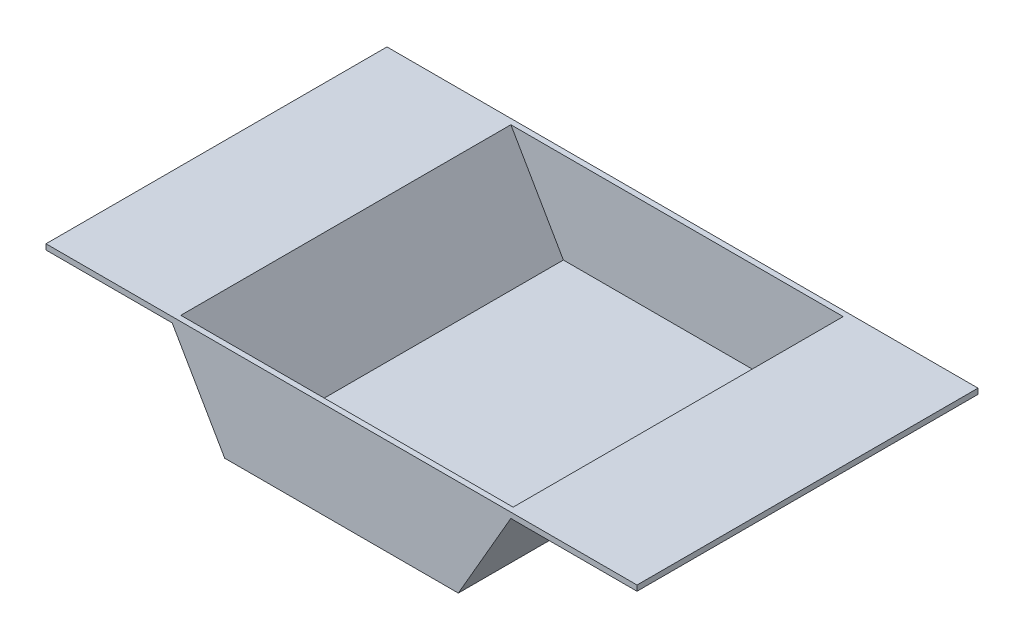
ISO-10303-21;
HEADER;
FILE_DESCRIPTION(('STEP AP214'),'2;1');
FILE_NAME('part.step','',(''),(''),'','','');
FILE_SCHEMA(('AUTOMOTIVE_DESIGN { 1 0 10303 214 1 1 1 1 }'));
ENDSEC;
DATA;
#1=APPLICATION_CONTEXT('core data for automotive mechanical design processes');
#2=APPLICATION_PROTOCOL_DEFINITION('international standard','automotive_design',2000,#1);
#3=PRODUCT_CONTEXT('',#1,'mechanical');
#4=PRODUCT('Part','Part','',(#3));
#5=PRODUCT_RELATED_PRODUCT_CATEGORY('part','',(#4));
#6=PRODUCT_DEFINITION_FORMATION('','',#4);
#7=PRODUCT_DEFINITION_CONTEXT('part definition',#1,'design');
#8=PRODUCT_DEFINITION('design','',#6,#7);
#9=PRODUCT_DEFINITION_SHAPE('','',#8);
#10=(LENGTH_UNIT() NAMED_UNIT(*) SI_UNIT(.MILLI.,.METRE.));
#11=(NAMED_UNIT(*) PLANE_ANGLE_UNIT() SI_UNIT($,.RADIAN.));
#12=(NAMED_UNIT(*) SI_UNIT($,.STERADIAN.) SOLID_ANGLE_UNIT());
#13=UNCERTAINTY_MEASURE_WITH_UNIT(LENGTH_MEASURE(1.E-05),#10,'distance_accuracy_value','');
#14=(GEOMETRIC_REPRESENTATION_CONTEXT(3) GLOBAL_UNCERTAINTY_ASSIGNED_CONTEXT((#13)) GLOBAL_UNIT_ASSIGNED_CONTEXT((#10,
#11,#12)) REPRESENTATION_CONTEXT('',''));
#15=CARTESIAN_POINT('',(0.,0.,0.));
#16=DIRECTION('',(0.,0.,1.));
#17=DIRECTION('',(1.,0.,0.));
#18=AXIS2_PLACEMENT_3D('',#15,#16,#17);
#19=CARTESIAN_POINT('',(-330.2,101.6,381.));
#20=DIRECTION('',(0.,-1.,0.));
#21=DIRECTION('',(0.,0.,-1.));
#22=AXIS2_PLACEMENT_3D('',#19,#20,#21);
#23=PLANE('',#22);
#24=DIRECTION('',(-1.,0.,0.));
#25=VECTOR('',#24,1.);
#26=CARTESIAN_POINT('',(-330.2,101.6,0.));
#27=LINE('',#26,#25);
#28=CARTESIAN_POINT('',(330.2,101.6,0.));
#29=VERTEX_POINT('',#28);
#30=CARTESIAN_POINT('',(-330.2,101.6,0.));
#31=VERTEX_POINT('',#30);
#32=EDGE_CURVE('E102',#29,#31,#27,.T.);
#33=ORIENTED_EDGE('',*,*,#32,.T.);
#34=DIRECTION('',(0.,0.,-1.));
#35=VECTOR('',#34,1.);
#36=CARTESIAN_POINT('',(-330.2,101.6,381.));
#37=LINE('',#36,#35);
#38=CARTESIAN_POINT('',(-330.2,101.6,381.));
#39=VERTEX_POINT('',#38);
#40=EDGE_CURVE('E154',#39,#31,#37,.T.);
#41=ORIENTED_EDGE('',*,*,#40,.F.);
#42=DIRECTION('',(-1.,0.,0.));
#43=VECTOR('',#42,1.);
#44=CARTESIAN_POINT('',(185.658787349666,101.6,381.));
#45=LINE('',#44,#43);
#46=CARTESIAN_POINT('',(330.2,101.6,381.));
#47=VERTEX_POINT('',#46);
#48=EDGE_CURVE('E70',#47,#39,#45,.T.);
#49=ORIENTED_EDGE('',*,*,#48,.F.);
#50=DIRECTION('',(0.,0.,-1.));
#51=VECTOR('',#50,1.);
#52=CARTESIAN_POINT('',(330.2,101.6,381.));
#53=LINE('',#52,#51);
#54=EDGE_CURVE('E148',#47,#29,#53,.T.);
#55=ORIENTED_EDGE('',*,*,#54,.T.);
#56=EDGE_LOOP('',(#33,#41,#49,#55));
#57=FACE_BOUND('',#56,.T.);
#58=DIRECTION('',(0.,0.,-1.));
#59=VECTOR('',#58,1.);
#60=CARTESIAN_POINT('',(185.658787349666,101.6,381.));
#61=LINE('',#60,#59);
#62=CARTESIAN_POINT('',(185.658787349666,101.6,374.904));
#63=VERTEX_POINT('',#62);
#64=CARTESIAN_POINT('',(185.658787349666,101.6,6.096));
#65=VERTEX_POINT('',#64);
#66=EDGE_CURVE('E235',#63,#65,#61,.T.);
#67=ORIENTED_EDGE('',*,*,#66,.F.);
#68=DIRECTION('',(-1.,0.,0.));
#69=VECTOR('',#68,1.);
#70=CARTESIAN_POINT('',(-330.2,101.6,374.904));
#71=LINE('',#70,#69);
#72=CARTESIAN_POINT('',(-185.658787349666,101.6,374.904));
#73=VERTEX_POINT('',#72);
#74=EDGE_CURVE('E231',#63,#73,#71,.T.);
#75=ORIENTED_EDGE('',*,*,#74,.T.);
#76=DIRECTION('',(0.,0.,-1.));
#77=VECTOR('',#76,1.);
#78=CARTESIAN_POINT('',(-185.658787349666,101.6,381.));
#79=LINE('',#78,#77);
#80=CARTESIAN_POINT('',(-185.658787349666,101.6,6.096));
#81=VERTEX_POINT('',#80);
#82=EDGE_CURVE('E163',#73,#81,#79,.T.);
#83=ORIENTED_EDGE('',*,*,#82,.T.);
#84=DIRECTION('',(-1.,0.,0.));
#85=VECTOR('',#84,1.);
#86=CARTESIAN_POINT('',(-330.2,101.6,6.09599999999999));
#87=LINE('',#86,#85);
#88=EDGE_CURVE('E226',#65,#81,#87,.T.);
#89=ORIENTED_EDGE('',*,*,#88,.F.);
#90=EDGE_LOOP('',(#67,#75,#83,#89));
#91=FACE_BOUND('',#90,.T.);
#92=ADVANCED_FACE('F45',(#57,#91),#23,.F.);
#93=CARTESIAN_POINT('',(-330.2,101.6,381.));
#94=DIRECTION('',(1.,0.,0.));
#95=DIRECTION('',(0.,0.,-1.));
#96=AXIS2_PLACEMENT_3D('',#93,#94,#95);
#97=PLANE('',#96);
#98=DIRECTION('',(0.,-1.,0.));
#99=VECTOR('',#98,1.);
#100=CARTESIAN_POINT('',(-330.2,101.6,0.));
#101=LINE('',#100,#99);
#102=CARTESIAN_POINT('',(-330.2,95.504,0.));
#103=VERTEX_POINT('',#102);
#104=EDGE_CURVE('E158',#31,#103,#101,.T.);
#105=ORIENTED_EDGE('',*,*,#104,.T.);
#106=DIRECTION('',(0.,0.,-1.));
#107=VECTOR('',#106,1.);
#108=CARTESIAN_POINT('',(-330.2,95.504,381.));
#109=LINE('',#108,#107);
#110=CARTESIAN_POINT('',(-330.2,95.504,381.));
#111=VERTEX_POINT('',#110);
#112=EDGE_CURVE('E11',#111,#103,#109,.T.);
#113=ORIENTED_EDGE('',*,*,#112,.F.);
#114=DIRECTION('',(0.,-1.,0.));
#115=VECTOR('',#114,1.);
#116=CARTESIAN_POINT('',(-330.2,101.6,381.));
#117=LINE('',#116,#115);
#118=EDGE_CURVE('E182',#39,#111,#117,.T.);
#119=ORIENTED_EDGE('',*,*,#118,.F.);
#120=ORIENTED_EDGE('',*,*,#40,.T.);
#121=EDGE_LOOP('',(#105,#113,#119,#120));
#122=FACE_BOUND('',#121,.T.);
#123=ADVANCED_FACE('F47',(#122),#97,.F.);
#124=CARTESIAN_POINT('',(-330.2,95.504,381.));
#125=DIRECTION('',(0.,1.,0.));
#126=DIRECTION('',(0.,0.,1.));
#127=AXIS2_PLACEMENT_3D('',#124,#125,#126);
#128=PLANE('',#127);
#129=DIRECTION('',(1.,0.,0.));
#130=VECTOR('',#129,1.);
#131=CARTESIAN_POINT('',(-330.2,95.504,0.));
#132=LINE('',#131,#130);
#133=CARTESIAN_POINT('',(-189.178314590646,95.504,0.));
#134=VERTEX_POINT('',#133);
#135=EDGE_CURVE('E162',#103,#134,#132,.T.);
#136=ORIENTED_EDGE('',*,*,#135,.T.);
#137=DIRECTION('',(0.,0.,-1.));
#138=VECTOR('',#137,1.);
#139=CARTESIAN_POINT('',(-189.178314590646,95.504,381.));
#140=LINE('',#139,#138);
#141=CARTESIAN_POINT('',(-189.178314590646,95.504,381.));
#142=VERTEX_POINT('',#141);
#143=EDGE_CURVE('E54',#142,#134,#140,.T.);
#144=ORIENTED_EDGE('',*,*,#143,.F.);
#145=DIRECTION('',(1.,0.,0.));
#146=VECTOR('',#145,1.);
#147=CARTESIAN_POINT('',(-330.2,95.504,381.));
#148=LINE('',#147,#146);
#149=EDGE_CURVE('E110',#111,#142,#148,.T.);
#150=ORIENTED_EDGE('',*,*,#149,.F.);
#151=ORIENTED_EDGE('',*,*,#112,.T.);
#152=EDGE_LOOP('',(#136,#144,#150,#151));
#153=FACE_BOUND('',#152,.T.);
#154=ADVANCED_FACE('F313',(#153),#128,.F.);
#155=CARTESIAN_POINT('',(-130.51952724098,-6.096,381.));
#156=DIRECTION('',(0.866025403784439,0.5,0.));
#157=DIRECTION('',(-0.5,0.866025403784439,0.));
#158=AXIS2_PLACEMENT_3D('',#155,#156,#157);
#159=PLANE('',#158);
#160=DIRECTION('',(0.5,-0.866025403784439,0.));
#161=VECTOR('',#160,1.);
#162=CARTESIAN_POINT('',(-130.51952724098,-6.096,0.));
#163=LINE('',#162,#161);
#164=CARTESIAN_POINT('',(-130.51952724098,-6.096,0.));
#165=VERTEX_POINT('',#164);
#166=EDGE_CURVE('E166',#134,#165,#163,.T.);
#167=ORIENTED_EDGE('',*,*,#166,.T.);
#168=DIRECTION('',(0.,0.,-1.));
#169=VECTOR('',#168,1.);
#170=CARTESIAN_POINT('',(-130.51952724098,-6.096,381.));
#171=LINE('',#170,#169);
#172=CARTESIAN_POINT('',(-130.51952724098,-6.096,381.));
#173=VERTEX_POINT('',#172);
#174=EDGE_CURVE('E193',#173,#165,#171,.T.);
#175=ORIENTED_EDGE('',*,*,#174,.F.);
#176=DIRECTION('',(0.5,-0.866025403784439,0.));
#177=VECTOR('',#176,1.);
#178=CARTESIAN_POINT('',(-130.51952724098,-6.096,381.));
#179=LINE('',#178,#177);
#180=EDGE_CURVE('E203',#142,#173,#179,.T.);
#181=ORIENTED_EDGE('',*,*,#180,.F.);
#182=ORIENTED_EDGE('',*,*,#143,.T.);
#183=EDGE_LOOP('',(#167,#175,#181,#182));
#184=FACE_BOUND('',#183,.T.);
#185=ADVANCED_FACE('F201',(#184),#159,.F.);
#186=CARTESIAN_POINT('',(-130.51952724098,-6.096,381.));
#187=DIRECTION('',(0.,1.,0.));
#188=DIRECTION('',(0.,0.,1.));
#189=AXIS2_PLACEMENT_3D('',#186,#187,#188);
#190=PLANE('',#189);
#191=DIRECTION('',(1.,0.,0.));
#192=VECTOR('',#191,1.);
#193=CARTESIAN_POINT('',(-130.51952724098,-6.096,0.));
#194=LINE('',#193,#192);
#195=CARTESIAN_POINT('',(130.51952724098,-6.096,0.));
#196=VERTEX_POINT('',#195);
#197=EDGE_CURVE('E169',#165,#196,#194,.T.);
#198=ORIENTED_EDGE('',*,*,#197,.T.);
#199=DIRECTION('',(0.,0.,-1.));
#200=VECTOR('',#199,1.);
#201=CARTESIAN_POINT('',(130.51952724098,-6.096,381.));
#202=LINE('',#201,#200);
#203=CARTESIAN_POINT('',(130.51952724098,-6.096,381.));
#204=VERTEX_POINT('',#203);
#205=EDGE_CURVE('E189',#204,#196,#202,.T.);
#206=ORIENTED_EDGE('',*,*,#205,.F.);
#207=DIRECTION('',(1.,0.,0.));
#208=VECTOR('',#207,1.);
#209=CARTESIAN_POINT('',(-130.51952724098,-6.096,381.));
#210=LINE('',#209,#208);
#211=EDGE_CURVE('E216',#173,#204,#210,.T.);
#212=ORIENTED_EDGE('',*,*,#211,.F.);
#213=ORIENTED_EDGE('',*,*,#174,.T.);
#214=EDGE_LOOP('',(#198,#206,#212,#213));
#215=FACE_BOUND('',#214,.T.);
#216=ADVANCED_FACE('F211',(#215),#190,.F.);
#217=CARTESIAN_POINT('',(130.51952724098,-6.096,381.));
#218=DIRECTION('',(-0.866025403784439,0.5,0.));
#219=DIRECTION('',(-0.5,-0.866025403784439,0.));
#220=AXIS2_PLACEMENT_3D('',#217,#218,#219);
#221=PLANE('',#220);
#222=DIRECTION('',(0.5,0.866025403784439,0.));
#223=VECTOR('',#222,1.);
#224=CARTESIAN_POINT('',(130.51952724098,-6.096,0.));
#225=LINE('',#224,#223);
#226=CARTESIAN_POINT('',(189.178314590646,95.504,0.));
#227=VERTEX_POINT('',#226);
#228=EDGE_CURVE('E172',#196,#227,#225,.T.);
#229=ORIENTED_EDGE('',*,*,#228,.T.);
#230=DIRECTION('',(0.,0.,-1.));
#231=VECTOR('',#230,1.);
#232=CARTESIAN_POINT('',(189.178314590646,95.504,381.));
#233=LINE('',#232,#231);
#234=CARTESIAN_POINT('',(189.178314590646,95.504,381.));
#235=VERTEX_POINT('',#234);
#236=EDGE_CURVE('E147',#235,#227,#233,.T.);
#237=ORIENTED_EDGE('',*,*,#236,.F.);
#238=DIRECTION('',(0.5,0.866025403784439,0.));
#239=VECTOR('',#238,1.);
#240=CARTESIAN_POINT('',(130.51952724098,-6.096,381.));
#241=LINE('',#240,#239);
#242=EDGE_CURVE('E132',#204,#235,#241,.T.);
#243=ORIENTED_EDGE('',*,*,#242,.F.);
#244=ORIENTED_EDGE('',*,*,#205,.T.);
#245=EDGE_LOOP('',(#229,#237,#243,#244));
#246=FACE_BOUND('',#245,.T.);
#247=ADVANCED_FACE('F214',(#246),#221,.F.);
#248=CARTESIAN_POINT('',(189.178314590646,95.504,381.));
#249=DIRECTION('',(0.,1.,0.));
#250=DIRECTION('',(0.,0.,1.));
#251=AXIS2_PLACEMENT_3D('',#248,#249,#250);
#252=PLANE('',#251);
#253=DIRECTION('',(1.,0.,0.));
#254=VECTOR('',#253,1.);
#255=CARTESIAN_POINT('',(189.178314590646,95.504,0.));
#256=LINE('',#255,#254);
#257=CARTESIAN_POINT('',(330.2,95.504,0.));
#258=VERTEX_POINT('',#257);
#259=EDGE_CURVE('E142',#227,#258,#256,.T.);
#260=ORIENTED_EDGE('',*,*,#259,.T.);
#261=DIRECTION('',(0.,0.,-1.));
#262=VECTOR('',#261,1.);
#263=CARTESIAN_POINT('',(330.2,95.504,381.));
#264=LINE('',#263,#262);
#265=CARTESIAN_POINT('',(330.2,95.504,381.));
#266=VERTEX_POINT('',#265);
#267=EDGE_CURVE('E139',#266,#258,#264,.T.);
#268=ORIENTED_EDGE('',*,*,#267,.F.);
#269=DIRECTION('',(1.,0.,0.));
#270=VECTOR('',#269,1.);
#271=CARTESIAN_POINT('',(189.178314590646,95.504,381.));
#272=LINE('',#271,#270);
#273=EDGE_CURVE('E125',#235,#266,#272,.T.);
#274=ORIENTED_EDGE('',*,*,#273,.F.);
#275=ORIENTED_EDGE('',*,*,#236,.T.);
#276=EDGE_LOOP('',(#260,#268,#274,#275));
#277=FACE_BOUND('',#276,.T.);
#278=ADVANCED_FACE('F140',(#277),#252,.F.);
#279=CARTESIAN_POINT('',(330.2,101.6,381.));
#280=DIRECTION('',(-1.,0.,0.));
#281=DIRECTION('',(0.,0.,1.));
#282=AXIS2_PLACEMENT_3D('',#279,#280,#281);
#283=PLANE('',#282);
#284=DIRECTION('',(0.,1.,0.));
#285=VECTOR('',#284,1.);
#286=CARTESIAN_POINT('',(330.2,101.6,0.));
#287=LINE('',#286,#285);
#288=EDGE_CURVE('E177',#258,#29,#287,.T.);
#289=ORIENTED_EDGE('',*,*,#288,.T.);
#290=ORIENTED_EDGE('',*,*,#54,.F.);
#291=DIRECTION('',(0.,1.,0.));
#292=VECTOR('',#291,1.);
#293=CARTESIAN_POINT('',(330.2,101.6,381.));
#294=LINE('',#293,#292);
#295=EDGE_CURVE('E129',#266,#47,#294,.T.);
#296=ORIENTED_EDGE('',*,*,#295,.F.);
#297=ORIENTED_EDGE('',*,*,#267,.T.);
#298=EDGE_LOOP('',(#289,#290,#296,#297));
#299=FACE_BOUND('',#298,.T.);
#300=ADVANCED_FACE('F150',(#299),#283,.F.);
#301=CARTESIAN_POINT('',(0.,0.,381.));
#302=DIRECTION('',(0.,0.,1.));
#303=DIRECTION('',(1.,0.,0.));
#304=AXIS2_PLACEMENT_3D('',#301,#302,#303);
#305=PLANE('',#304);
#306=ORIENTED_EDGE('',*,*,#118,.T.);
#307=ORIENTED_EDGE('',*,*,#149,.T.);
#308=ORIENTED_EDGE('',*,*,#180,.T.);
#309=ORIENTED_EDGE('',*,*,#211,.T.);
#310=ORIENTED_EDGE('',*,*,#242,.T.);
#311=ORIENTED_EDGE('',*,*,#273,.T.);
#312=ORIENTED_EDGE('',*,*,#295,.T.);
#313=ORIENTED_EDGE('',*,*,#48,.T.);
#314=EDGE_LOOP('',(#306,#307,#308,#309,#310,#311,#312,#313));
#315=FACE_BOUND('',#314,.T.);
#316=ADVANCED_FACE('F127',(#315),#305,.T.);
#317=CARTESIAN_POINT('',(0.,0.,0.));
#318=DIRECTION('',(0.,0.,1.));
#319=DIRECTION('',(1.,0.,0.));
#320=AXIS2_PLACEMENT_3D('',#317,#318,#319);
#321=PLANE('',#320);
#322=ORIENTED_EDGE('',*,*,#104,.F.);
#323=ORIENTED_EDGE('',*,*,#32,.F.);
#324=ORIENTED_EDGE('',*,*,#288,.F.);
#325=ORIENTED_EDGE('',*,*,#259,.F.);
#326=ORIENTED_EDGE('',*,*,#228,.F.);
#327=ORIENTED_EDGE('',*,*,#197,.F.);
#328=ORIENTED_EDGE('',*,*,#166,.F.);
#329=ORIENTED_EDGE('',*,*,#135,.F.);
#330=EDGE_LOOP('',(#322,#323,#324,#325,#326,#327,#328,#329));
#331=FACE_BOUND('',#330,.T.);
#332=ADVANCED_FACE('F207',(#331),#321,.F.);
#333=CARTESIAN_POINT('',(-125.24023637951,-3.048,381.));
#334=DIRECTION('',(0.866025403784439,0.5,0.));
#335=DIRECTION('',(-0.5,0.866025403784439,0.));
#336=AXIS2_PLACEMENT_3D('',#333,#334,#335);
#337=PLANE('',#336);
#338=DIRECTION('',(0.5,-0.866025403784439,0.));
#339=VECTOR('',#338,1.);
#340=CARTESIAN_POINT('',(-125.24023637951,-3.048,6.09599999999999));
#341=LINE('',#340,#339);
#342=CARTESIAN_POINT('',(-127.,0.,6.096));
#343=VERTEX_POINT('',#342);
#344=EDGE_CURVE('E259',#81,#343,#341,.T.);
#345=ORIENTED_EDGE('',*,*,#344,.F.);
#346=ORIENTED_EDGE('',*,*,#82,.F.);
#347=DIRECTION('',(0.5,-0.866025403784439,0.));
#348=VECTOR('',#347,1.);
#349=CARTESIAN_POINT('',(-125.24023637951,-3.048,374.904));
#350=LINE('',#349,#348);
#351=CARTESIAN_POINT('',(-127.,0.,374.904));
#352=VERTEX_POINT('',#351);
#353=EDGE_CURVE('E61',#73,#352,#350,.T.);
#354=ORIENTED_EDGE('',*,*,#353,.T.);
#355=DIRECTION('',(0.,0.,-1.));
#356=VECTOR('',#355,1.);
#357=CARTESIAN_POINT('',(-127.,0.,381.));
#358=LINE('',#357,#356);
#359=EDGE_CURVE('E255',#352,#343,#358,.T.);
#360=ORIENTED_EDGE('',*,*,#359,.T.);
#361=EDGE_LOOP('',(#345,#346,#354,#360));
#362=FACE_BOUND('',#361,.T.);
#363=ADVANCED_FACE('F278',(#362),#337,.T.);
#364=CARTESIAN_POINT('',(-130.51952724098,0.,381.));
#365=DIRECTION('',(0.,1.,0.));
#366=DIRECTION('',(0.,0.,1.));
#367=AXIS2_PLACEMENT_3D('',#364,#365,#366);
#368=PLANE('',#367);
#369=DIRECTION('',(1.,0.,0.));
#370=VECTOR('',#369,1.);
#371=CARTESIAN_POINT('',(-130.51952724098,0.,6.09599999999999));
#372=LINE('',#371,#370);
#373=CARTESIAN_POINT('',(127.,0.,6.096));
#374=VERTEX_POINT('',#373);
#375=EDGE_CURVE('E248',#343,#374,#372,.T.);
#376=ORIENTED_EDGE('',*,*,#375,.F.);
#377=ORIENTED_EDGE('',*,*,#359,.F.);
#378=DIRECTION('',(1.,0.,0.));
#379=VECTOR('',#378,1.);
#380=CARTESIAN_POINT('',(-130.51952724098,0.,374.904));
#381=LINE('',#380,#379);
#382=CARTESIAN_POINT('',(127.,0.,374.904));
#383=VERTEX_POINT('',#382);
#384=EDGE_CURVE('E240',#352,#383,#381,.T.);
#385=ORIENTED_EDGE('',*,*,#384,.T.);
#386=DIRECTION('',(0.,0.,-1.));
#387=VECTOR('',#386,1.);
#388=CARTESIAN_POINT('',(127.,0.,381.));
#389=LINE('',#388,#387);
#390=EDGE_CURVE('E244',#383,#374,#389,.T.);
#391=ORIENTED_EDGE('',*,*,#390,.T.);
#392=EDGE_LOOP('',(#376,#377,#385,#391));
#393=FACE_BOUND('',#392,.T.);
#394=ADVANCED_FACE('F298',(#393),#368,.T.);
#395=CARTESIAN_POINT('',(125.24023637951,-3.048,381.));
#396=DIRECTION('',(-0.866025403784439,0.5,0.));
#397=DIRECTION('',(-0.5,-0.866025403784439,0.));
#398=AXIS2_PLACEMENT_3D('',#395,#396,#397);
#399=PLANE('',#398);
#400=DIRECTION('',(0.5,0.866025403784439,0.));
#401=VECTOR('',#400,1.);
#402=CARTESIAN_POINT('',(125.24023637951,-3.048,6.09599999999999));
#403=LINE('',#402,#401);
#404=EDGE_CURVE('E230',#374,#65,#403,.T.);
#405=ORIENTED_EDGE('',*,*,#404,.F.);
#406=ORIENTED_EDGE('',*,*,#390,.F.);
#407=DIRECTION('',(0.5,0.866025403784439,0.));
#408=VECTOR('',#407,1.);
#409=CARTESIAN_POINT('',(125.24023637951,-3.048,374.904));
#410=LINE('',#409,#408);
#411=EDGE_CURVE('E236',#383,#63,#410,.T.);
#412=ORIENTED_EDGE('',*,*,#411,.T.);
#413=ORIENTED_EDGE('',*,*,#66,.T.);
#414=EDGE_LOOP('',(#405,#406,#412,#413));
#415=FACE_BOUND('',#414,.T.);
#416=ADVANCED_FACE('F294',(#415),#399,.T.);
#417=CARTESIAN_POINT('',(0.,0.,374.904));
#418=DIRECTION('',(0.,0.,1.));
#419=DIRECTION('',(1.,0.,0.));
#420=AXIS2_PLACEMENT_3D('',#417,#418,#419);
#421=PLANE('',#420);
#422=ORIENTED_EDGE('',*,*,#411,.F.);
#423=ORIENTED_EDGE('',*,*,#384,.F.);
#424=ORIENTED_EDGE('',*,*,#353,.F.);
#425=ORIENTED_EDGE('',*,*,#74,.F.);
#426=EDGE_LOOP('',(#422,#423,#424,#425));
#427=FACE_BOUND('',#426,.T.);
#428=ADVANCED_FACE('F296',(#427),#421,.F.);
#429=CARTESIAN_POINT('',(0.,0.,6.096));
#430=DIRECTION('',(0.,0.,1.));
#431=DIRECTION('',(1.,0.,0.));
#432=AXIS2_PLACEMENT_3D('',#429,#430,#431);
#433=PLANE('',#432);
#434=ORIENTED_EDGE('',*,*,#344,.T.);
#435=ORIENTED_EDGE('',*,*,#375,.T.);
#436=ORIENTED_EDGE('',*,*,#404,.T.);
#437=ORIENTED_EDGE('',*,*,#88,.T.);
#438=EDGE_LOOP('',(#434,#435,#436,#437));
#439=FACE_BOUND('',#438,.T.);
#440=ADVANCED_FACE('F283',(#439),#433,.T.);
#441=CLOSED_SHELL('',(#92,#123,#154,#185,#216,#247,#278,#300,#316,#332,#363,#394,#416,#428,#440));
#442=MANIFOLD_SOLID_BREP('B2',#441);
#443=ADVANCED_BREP_SHAPE_REPRESENTATION('',(#18,#442),#14);
#444=SHAPE_DEFINITION_REPRESENTATION(#9,#443);
ENDSEC;
END-ISO-10303-21;
